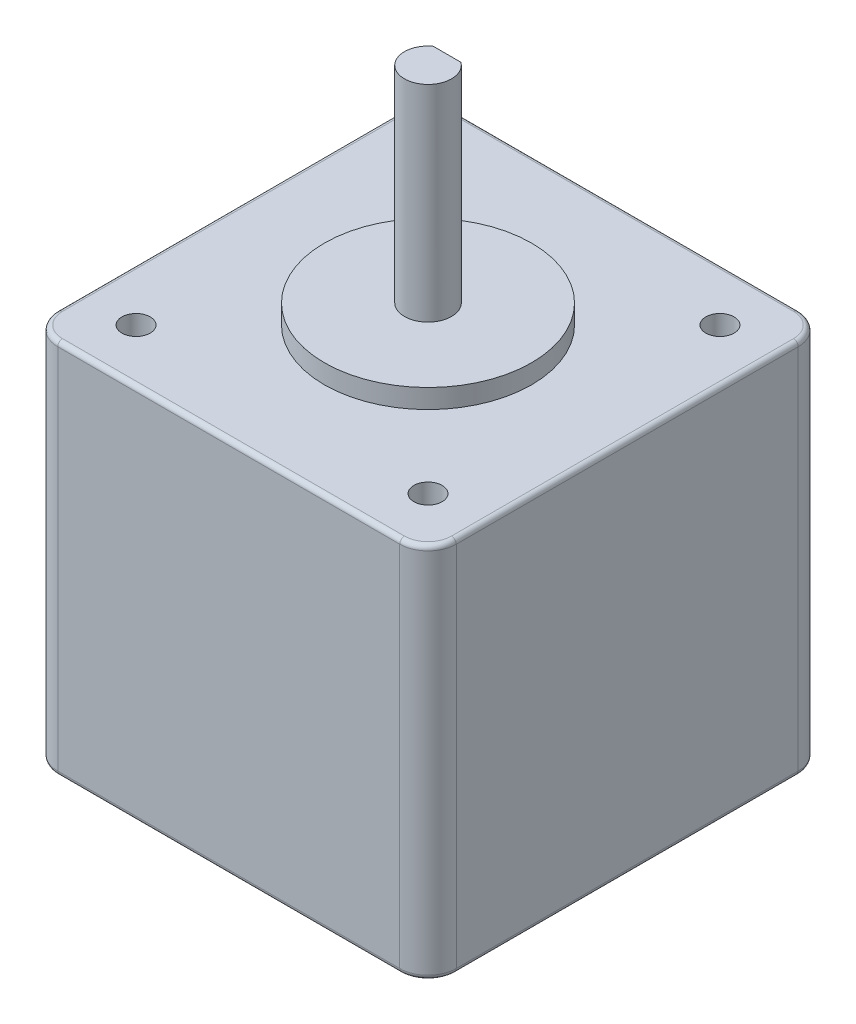
ISO-10303-21;
HEADER;
FILE_DESCRIPTION(('STEP AP214'),'2;1');
FILE_NAME('part.step','',(''),(''),'','','');
FILE_SCHEMA(('AUTOMOTIVE_DESIGN { 1 0 10303 214 1 1 1 1 }'));
ENDSEC;
DATA;
#1=APPLICATION_CONTEXT('core data for automotive mechanical design processes');
#2=APPLICATION_PROTOCOL_DEFINITION('international standard','automotive_design',2000,#1);
#3=PRODUCT_CONTEXT('',#1,'mechanical');
#4=PRODUCT('Part','Part','',(#3));
#5=PRODUCT_RELATED_PRODUCT_CATEGORY('part','',(#4));
#6=PRODUCT_DEFINITION_FORMATION('','',#4);
#7=PRODUCT_DEFINITION_CONTEXT('part definition',#1,'design');
#8=PRODUCT_DEFINITION('design','',#6,#7);
#9=PRODUCT_DEFINITION_SHAPE('','',#8);
#10=(LENGTH_UNIT() NAMED_UNIT(*) SI_UNIT(.MILLI.,.METRE.));
#11=(NAMED_UNIT(*) PLANE_ANGLE_UNIT() SI_UNIT($,.RADIAN.));
#12=(NAMED_UNIT(*) SI_UNIT($,.STERADIAN.) SOLID_ANGLE_UNIT());
#13=UNCERTAINTY_MEASURE_WITH_UNIT(LENGTH_MEASURE(1.E-05),#10,'distance_accuracy_value','');
#14=(GEOMETRIC_REPRESENTATION_CONTEXT(3) GLOBAL_UNCERTAINTY_ASSIGNED_CONTEXT((#13)) GLOBAL_UNIT_ASSIGNED_CONTEXT((#10,
#11,#12)) REPRESENTATION_CONTEXT('',''));
#15=CARTESIAN_POINT('',(0.,0.,0.));
#16=DIRECTION('',(0.,0.,1.));
#17=DIRECTION('',(1.,0.,0.));
#18=AXIS2_PLACEMENT_3D('',#15,#16,#17);
#19=CARTESIAN_POINT('',(0.,40.,0.));
#20=DIRECTION('',(0.,-1.,0.));
#21=DIRECTION('',(0.,0.,-1.));
#22=AXIS2_PLACEMENT_3D('',#19,#20,#21);
#23=PLANE('',#22);
#24=DIRECTION('',(0.,0.,1.));
#25=VECTOR('',#24,1.);
#26=CARTESIAN_POINT('',(0.5,40.,0.));
#27=LINE('',#26,#25);
#28=CARTESIAN_POINT('',(0.5,40.,-39.3));
#29=VERTEX_POINT('',#28);
#30=CARTESIAN_POINT('',(0.5,40.,-3.));
#31=VERTEX_POINT('',#30);
#32=EDGE_CURVE('E50',#29,#31,#27,.T.);
#33=ORIENTED_EDGE('',*,*,#32,.T.);
#34=CARTESIAN_POINT('',(3.,40.,-3.));
#35=DIRECTION('',(0.,-1.,0.));
#36=DIRECTION('',(0.,0.,-1.));
#37=AXIS2_PLACEMENT_3D('',#34,#35,#36);
#38=CIRCLE('',#37,2.5);
#39=CARTESIAN_POINT('',(3.,40.,-0.5));
#40=VERTEX_POINT('',#39);
#41=EDGE_CURVE('E300',#31,#40,#38,.F.);
#42=ORIENTED_EDGE('',*,*,#41,.T.);
#43=DIRECTION('',(1.,0.,0.));
#44=VECTOR('',#43,1.);
#45=CARTESIAN_POINT('',(0.,40.,-0.5));
#46=LINE('',#45,#44);
#47=CARTESIAN_POINT('',(39.3,40.,-0.5));
#48=VERTEX_POINT('',#47);
#49=EDGE_CURVE('E288',#40,#48,#46,.T.);
#50=ORIENTED_EDGE('',*,*,#49,.T.);
#51=CARTESIAN_POINT('',(39.3,40.,-3.));
#52=DIRECTION('',(0.,-1.,0.));
#53=DIRECTION('',(0.,0.,-1.));
#54=AXIS2_PLACEMENT_3D('',#51,#52,#53);
#55=CIRCLE('',#54,2.5);
#56=CARTESIAN_POINT('',(41.8,40.,-3.));
#57=VERTEX_POINT('',#56);
#58=EDGE_CURVE('E290',#48,#57,#55,.F.);
#59=ORIENTED_EDGE('',*,*,#58,.T.);
#60=DIRECTION('',(0.,0.,-1.));
#61=VECTOR('',#60,1.);
#62=CARTESIAN_POINT('',(41.8,40.,0.));
#63=LINE('',#62,#61);
#64=CARTESIAN_POINT('',(41.8,40.,-39.3));
#65=VERTEX_POINT('',#64);
#66=EDGE_CURVE('E292',#57,#65,#63,.T.);
#67=ORIENTED_EDGE('',*,*,#66,.T.);
#68=CARTESIAN_POINT('',(39.3,40.,-39.3));
#69=DIRECTION('',(0.,-1.,0.));
#70=DIRECTION('',(0.,0.,-1.));
#71=AXIS2_PLACEMENT_3D('',#68,#69,#70);
#72=CIRCLE('',#71,2.5);
#73=CARTESIAN_POINT('',(39.3,40.,-41.8));
#74=VERTEX_POINT('',#73);
#75=EDGE_CURVE('E294',#65,#74,#72,.F.);
#76=ORIENTED_EDGE('',*,*,#75,.T.);
#77=DIRECTION('',(-1.,0.,0.));
#78=VECTOR('',#77,1.);
#79=CARTESIAN_POINT('',(0.,40.,-41.8));
#80=LINE('',#79,#78);
#81=CARTESIAN_POINT('',(3.,40.,-41.8));
#82=VERTEX_POINT('',#81);
#83=EDGE_CURVE('E296',#74,#82,#80,.T.);
#84=ORIENTED_EDGE('',*,*,#83,.T.);
#85=CARTESIAN_POINT('',(3.,40.,-39.3));
#86=DIRECTION('',(0.,-1.,0.));
#87=DIRECTION('',(0.,0.,-1.));
#88=AXIS2_PLACEMENT_3D('',#85,#86,#87);
#89=CIRCLE('',#88,2.5);
#90=EDGE_CURVE('E55',#82,#29,#89,.F.);
#91=ORIENTED_EDGE('',*,*,#90,.T.);
#92=EDGE_LOOP('',(#33,#42,#50,#59,#67,#76,#84,#91));
#93=FACE_BOUND('',#92,.T.);
#94=CARTESIAN_POINT('',(21.15,40.,-21.15));
#95=DIRECTION('',(0.,1.,0.));
#96=DIRECTION('',(0.,0.,1.));
#97=AXIS2_PLACEMENT_3D('',#94,#95,#96);
#98=CIRCLE('',#97,11.);
#99=CARTESIAN_POINT('',(21.15,40.,-10.15));
#100=VERTEX_POINT('',#99);
#101=EDGE_CURVE('E189',#100,#100,#98,.T.);
#102=ORIENTED_EDGE('',*,*,#101,.F.);
#103=EDGE_LOOP('',(#102));
#104=FACE_BOUND('',#103,.T.);
#105=CARTESIAN_POINT('',(5.655,40.,-36.645));
#106=DIRECTION('',(0.,1.,0.));
#107=DIRECTION('',(0.,0.,1.));
#108=AXIS2_PLACEMENT_3D('',#105,#106,#107);
#109=CIRCLE('',#108,1.5);
#110=CARTESIAN_POINT('',(5.655,40.,-35.145));
#111=VERTEX_POINT('',#110);
#112=EDGE_CURVE('E195',#111,#111,#109,.T.);
#113=ORIENTED_EDGE('',*,*,#112,.F.);
#114=EDGE_LOOP('',(#113));
#115=FACE_BOUND('',#114,.T.);
#116=CARTESIAN_POINT('',(36.645,40.,-36.645));
#117=DIRECTION('',(0.,1.,0.));
#118=DIRECTION('',(0.,0.,1.));
#119=AXIS2_PLACEMENT_3D('',#116,#117,#118);
#120=CIRCLE('',#119,1.5);
#121=CARTESIAN_POINT('',(36.645,40.,-35.145));
#122=VERTEX_POINT('',#121);
#123=EDGE_CURVE('E208',#122,#122,#120,.T.);
#124=ORIENTED_EDGE('',*,*,#123,.F.);
#125=EDGE_LOOP('',(#124));
#126=FACE_BOUND('',#125,.T.);
#127=CARTESIAN_POINT('',(36.645,40.,-5.655));
#128=DIRECTION('',(0.,1.,0.));
#129=DIRECTION('',(0.,0.,1.));
#130=AXIS2_PLACEMENT_3D('',#127,#128,#129);
#131=CIRCLE('',#130,1.5);
#132=CARTESIAN_POINT('',(36.645,40.,-4.155));
#133=VERTEX_POINT('',#132);
#134=EDGE_CURVE('E202',#133,#133,#131,.T.);
#135=ORIENTED_EDGE('',*,*,#134,.F.);
#136=EDGE_LOOP('',(#135));
#137=FACE_BOUND('',#136,.T.);
#138=CARTESIAN_POINT('',(5.655,40.,-5.655));
#139=DIRECTION('',(0.,1.,0.));
#140=DIRECTION('',(0.,0.,1.));
#141=AXIS2_PLACEMENT_3D('',#138,#139,#140);
#142=CIRCLE('',#141,1.5);
#143=CARTESIAN_POINT('',(5.655,40.,-4.155));
#144=VERTEX_POINT('',#143);
#145=EDGE_CURVE('E196',#144,#144,#142,.T.);
#146=ORIENTED_EDGE('',*,*,#145,.F.);
#147=EDGE_LOOP('',(#146));
#148=FACE_BOUND('',#147,.T.);
#149=ADVANCED_FACE('F33',(#93,#104,#115,#126,#137,#148),#23,.F.);
#150=CARTESIAN_POINT('',(0.,0.,0.));
#151=DIRECTION('',(0.,-1.,0.));
#152=DIRECTION('',(0.,0.,-1.));
#153=AXIS2_PLACEMENT_3D('',#150,#151,#152);
#154=PLANE('',#153);
#155=DIRECTION('',(1.,0.,0.));
#156=VECTOR('',#155,1.);
#157=CARTESIAN_POINT('',(3.,0.,-0.5));
#158=LINE('',#157,#156);
#159=CARTESIAN_POINT('',(39.3,0.,-0.5));
#160=VERTEX_POINT('',#159);
#161=CARTESIAN_POINT('',(3.,0.,-0.5));
#162=VERTEX_POINT('',#161);
#163=EDGE_CURVE('E241',#160,#162,#158,.F.);
#164=ORIENTED_EDGE('',*,*,#163,.T.);
#165=CARTESIAN_POINT('',(3.,0.,-3.));
#166=DIRECTION('',(0.,-1.,0.));
#167=DIRECTION('',(0.,0.,-1.));
#168=AXIS2_PLACEMENT_3D('',#165,#166,#167);
#169=CIRCLE('',#168,2.5);
#170=CARTESIAN_POINT('',(0.5,0.,-3.));
#171=VERTEX_POINT('',#170);
#172=EDGE_CURVE('E255',#162,#171,#169,.T.);
#173=ORIENTED_EDGE('',*,*,#172,.T.);
#174=DIRECTION('',(0.,0.,1.));
#175=VECTOR('',#174,1.);
#176=CARTESIAN_POINT('',(0.5,0.,-39.3));
#177=LINE('',#176,#175);
#178=CARTESIAN_POINT('',(0.5,0.,-39.3));
#179=VERTEX_POINT('',#178);
#180=EDGE_CURVE('E253',#171,#179,#177,.F.);
#181=ORIENTED_EDGE('',*,*,#180,.T.);
#182=CARTESIAN_POINT('',(3.,0.,-39.3));
#183=DIRECTION('',(0.,-1.,0.));
#184=DIRECTION('',(0.,0.,-1.));
#185=AXIS2_PLACEMENT_3D('',#182,#183,#184);
#186=CIRCLE('',#185,2.5);
#187=CARTESIAN_POINT('',(3.,0.,-41.8));
#188=VERTEX_POINT('',#187);
#189=EDGE_CURVE('E251',#179,#188,#186,.T.);
#190=ORIENTED_EDGE('',*,*,#189,.T.);
#191=DIRECTION('',(-1.,0.,0.));
#192=VECTOR('',#191,1.);
#193=CARTESIAN_POINT('',(39.3,0.,-41.8));
#194=LINE('',#193,#192);
#195=CARTESIAN_POINT('',(39.3,0.,-41.8));
#196=VERTEX_POINT('',#195);
#197=EDGE_CURVE('E249',#188,#196,#194,.F.);
#198=ORIENTED_EDGE('',*,*,#197,.T.);
#199=CARTESIAN_POINT('',(39.3,0.,-39.3));
#200=DIRECTION('',(0.,-1.,0.));
#201=DIRECTION('',(0.,0.,-1.));
#202=AXIS2_PLACEMENT_3D('',#199,#200,#201);
#203=CIRCLE('',#202,2.5);
#204=CARTESIAN_POINT('',(41.8,0.,-39.3));
#205=VERTEX_POINT('',#204);
#206=EDGE_CURVE('E247',#196,#205,#203,.T.);
#207=ORIENTED_EDGE('',*,*,#206,.T.);
#208=DIRECTION('',(0.,0.,-1.));
#209=VECTOR('',#208,1.);
#210=CARTESIAN_POINT('',(41.8,0.,-3.));
#211=LINE('',#210,#209);
#212=CARTESIAN_POINT('',(41.8,0.,-3.));
#213=VERTEX_POINT('',#212);
#214=EDGE_CURVE('E245',#205,#213,#211,.F.);
#215=ORIENTED_EDGE('',*,*,#214,.T.);
#216=CARTESIAN_POINT('',(39.3,0.,-3.));
#217=DIRECTION('',(0.,-1.,0.));
#218=DIRECTION('',(0.,0.,-1.));
#219=AXIS2_PLACEMENT_3D('',#216,#217,#218);
#220=CIRCLE('',#219,2.5);
#221=EDGE_CURVE('E243',#213,#160,#220,.T.);
#222=ORIENTED_EDGE('',*,*,#221,.T.);
#223=EDGE_LOOP('',(#164,#173,#181,#190,#198,#207,#215,#222));
#224=FACE_BOUND('',#223,.T.);
#225=CARTESIAN_POINT('',(36.645,0.,-5.655));
#226=DIRECTION('',(0.,1.,0.));
#227=DIRECTION('',(0.,0.,1.));
#228=AXIS2_PLACEMENT_3D('',#225,#226,#227);
#229=CIRCLE('',#228,1.5);
#230=CARTESIAN_POINT('',(36.645,0.,-4.155));
#231=VERTEX_POINT('',#230);
#232=EDGE_CURVE('E199',#231,#231,#229,.T.);
#233=ORIENTED_EDGE('',*,*,#232,.T.);
#234=EDGE_LOOP('',(#233));
#235=FACE_BOUND('',#234,.T.);
#236=CARTESIAN_POINT('',(5.655,0.,-36.645));
#237=DIRECTION('',(0.,1.,0.));
#238=DIRECTION('',(0.,0.,1.));
#239=AXIS2_PLACEMENT_3D('',#236,#237,#238);
#240=CIRCLE('',#239,1.5);
#241=CARTESIAN_POINT('',(5.655,0.,-35.145));
#242=VERTEX_POINT('',#241);
#243=EDGE_CURVE('E211',#242,#242,#240,.T.);
#244=ORIENTED_EDGE('',*,*,#243,.T.);
#245=EDGE_LOOP('',(#244));
#246=FACE_BOUND('',#245,.T.);
#247=CARTESIAN_POINT('',(36.645,0.,-36.645));
#248=DIRECTION('',(0.,1.,0.));
#249=DIRECTION('',(0.,0.,1.));
#250=AXIS2_PLACEMENT_3D('',#247,#248,#249);
#251=CIRCLE('',#250,1.5);
#252=CARTESIAN_POINT('',(36.645,0.,-35.145));
#253=VERTEX_POINT('',#252);
#254=EDGE_CURVE('E205',#253,#253,#251,.T.);
#255=ORIENTED_EDGE('',*,*,#254,.T.);
#256=EDGE_LOOP('',(#255));
#257=FACE_BOUND('',#256,.T.);
#258=CARTESIAN_POINT('',(5.655,0.,-5.655));
#259=DIRECTION('',(0.,1.,0.));
#260=DIRECTION('',(0.,0.,1.));
#261=AXIS2_PLACEMENT_3D('',#258,#259,#260);
#262=CIRCLE('',#261,1.5);
#263=CARTESIAN_POINT('',(5.655,0.,-4.155));
#264=VERTEX_POINT('',#263);
#265=EDGE_CURVE('E192',#264,#264,#262,.T.);
#266=ORIENTED_EDGE('',*,*,#265,.T.);
#267=EDGE_LOOP('',(#266));
#268=FACE_BOUND('',#267,.T.);
#269=ADVANCED_FACE('F377',(#224,#235,#246,#257,#268),#154,.T.);
#270=CARTESIAN_POINT('',(0.,40.,0.));
#271=DIRECTION('',(1.,0.,0.));
#272=DIRECTION('',(0.,0.,-1.));
#273=AXIS2_PLACEMENT_3D('',#270,#271,#272);
#274=PLANE('',#273);
#275=DIRECTION('',(0.,-1.,0.));
#276=VECTOR('',#275,1.);
#277=CARTESIAN_POINT('',(0.,40.,-39.3));
#278=LINE('',#277,#276);
#279=CARTESIAN_POINT('',(0.,39.5,-39.3));
#280=VERTEX_POINT('',#279);
#281=CARTESIAN_POINT('',(0.,0.5,-39.3));
#282=VERTEX_POINT('',#281);
#283=EDGE_CURVE('E220',#280,#282,#278,.T.);
#284=ORIENTED_EDGE('',*,*,#283,.T.);
#285=DIRECTION('',(0.,0.,1.));
#286=VECTOR('',#285,1.);
#287=CARTESIAN_POINT('',(0.,0.5,-3.));
#288=LINE('',#287,#286);
#289=CARTESIAN_POINT('',(0.,0.5,-3.));
#290=VERTEX_POINT('',#289);
#291=EDGE_CURVE('E266',#282,#290,#288,.T.);
#292=ORIENTED_EDGE('',*,*,#291,.T.);
#293=DIRECTION('',(0.,-1.,0.));
#294=VECTOR('',#293,1.);
#295=CARTESIAN_POINT('',(0.,40.,-3.));
#296=LINE('',#295,#294);
#297=CARTESIAN_POINT('',(0.,39.5,-3.));
#298=VERTEX_POINT('',#297);
#299=EDGE_CURVE('E188',#290,#298,#296,.F.);
#300=ORIENTED_EDGE('',*,*,#299,.T.);
#301=DIRECTION('',(0.,0.,1.));
#302=VECTOR('',#301,1.);
#303=CARTESIAN_POINT('',(0.,39.5,0.));
#304=LINE('',#303,#302);
#305=EDGE_CURVE('E264',#298,#280,#304,.F.);
#306=ORIENTED_EDGE('',*,*,#305,.T.);
#307=EDGE_LOOP('',(#284,#292,#300,#306));
#308=FACE_BOUND('',#307,.T.);
#309=ADVANCED_FACE('F408',(#308),#274,.F.);
#310=CARTESIAN_POINT('',(0.,40.,0.));
#311=DIRECTION('',(0.,0.,-1.));
#312=DIRECTION('',(-1.,0.,0.));
#313=AXIS2_PLACEMENT_3D('',#310,#311,#312);
#314=PLANE('',#313);
#315=DIRECTION('',(0.,-1.,0.));
#316=VECTOR('',#315,1.);
#317=CARTESIAN_POINT('',(3.,40.,0.));
#318=LINE('',#317,#316);
#319=CARTESIAN_POINT('',(3.,39.5,0.));
#320=VERTEX_POINT('',#319);
#321=CARTESIAN_POINT('',(3.,0.5,0.));
#322=VERTEX_POINT('',#321);
#323=EDGE_CURVE('E235',#320,#322,#318,.T.);
#324=ORIENTED_EDGE('',*,*,#323,.T.);
#325=DIRECTION('',(1.,0.,0.));
#326=VECTOR('',#325,1.);
#327=CARTESIAN_POINT('',(39.3,0.5,0.));
#328=LINE('',#327,#326);
#329=CARTESIAN_POINT('',(39.3,0.5,0.));
#330=VERTEX_POINT('',#329);
#331=EDGE_CURVE('E11',#322,#330,#328,.T.);
#332=ORIENTED_EDGE('',*,*,#331,.T.);
#333=DIRECTION('',(0.,-1.,0.));
#334=VECTOR('',#333,1.);
#335=CARTESIAN_POINT('',(39.3,40.,0.));
#336=LINE('',#335,#334);
#337=CARTESIAN_POINT('',(39.3,39.5,0.));
#338=VERTEX_POINT('',#337);
#339=EDGE_CURVE('E238',#330,#338,#336,.F.);
#340=ORIENTED_EDGE('',*,*,#339,.T.);
#341=DIRECTION('',(1.,0.,0.));
#342=VECTOR('',#341,1.);
#343=CARTESIAN_POINT('',(0.,39.5,0.));
#344=LINE('',#343,#342);
#345=EDGE_CURVE('E42',#338,#320,#344,.F.);
#346=ORIENTED_EDGE('',*,*,#345,.T.);
#347=EDGE_LOOP('',(#324,#332,#340,#346));
#348=FACE_BOUND('',#347,.T.);
#349=ADVANCED_FACE('F422',(#348),#314,.F.);
#350=CARTESIAN_POINT('',(42.3,40.,0.));
#351=DIRECTION('',(-1.,0.,0.));
#352=DIRECTION('',(0.,0.,1.));
#353=AXIS2_PLACEMENT_3D('',#350,#351,#352);
#354=PLANE('',#353);
#355=DIRECTION('',(0.,-1.,0.));
#356=VECTOR('',#355,1.);
#357=CARTESIAN_POINT('',(42.3,40.,-3.));
#358=LINE('',#357,#356);
#359=CARTESIAN_POINT('',(42.3,39.5,-3.));
#360=VERTEX_POINT('',#359);
#361=CARTESIAN_POINT('',(42.3,0.5,-3.));
#362=VERTEX_POINT('',#361);
#363=EDGE_CURVE('E229',#360,#362,#358,.T.);
#364=ORIENTED_EDGE('',*,*,#363,.T.);
#365=DIRECTION('',(0.,0.,-1.));
#366=VECTOR('',#365,1.);
#367=CARTESIAN_POINT('',(42.3,0.5,-39.3));
#368=LINE('',#367,#366);
#369=CARTESIAN_POINT('',(42.3,0.5,-39.3));
#370=VERTEX_POINT('',#369);
#371=EDGE_CURVE('E282',#362,#370,#368,.T.);
#372=ORIENTED_EDGE('',*,*,#371,.T.);
#373=DIRECTION('',(0.,-1.,0.));
#374=VECTOR('',#373,1.);
#375=CARTESIAN_POINT('',(42.3,40.,-39.3));
#376=LINE('',#375,#374);
#377=CARTESIAN_POINT('',(42.3,39.5,-39.3));
#378=VERTEX_POINT('',#377);
#379=EDGE_CURVE('E232',#370,#378,#376,.F.);
#380=ORIENTED_EDGE('',*,*,#379,.T.);
#381=DIRECTION('',(0.,0.,-1.));
#382=VECTOR('',#381,1.);
#383=CARTESIAN_POINT('',(42.3,39.5,0.));
#384=LINE('',#383,#382);
#385=EDGE_CURVE('E280',#378,#360,#384,.F.);
#386=ORIENTED_EDGE('',*,*,#385,.T.);
#387=EDGE_LOOP('',(#364,#372,#380,#386));
#388=FACE_BOUND('',#387,.T.);
#389=ADVANCED_FACE('F362',(#388),#354,.F.);
#390=CARTESIAN_POINT('',(0.,40.,-42.3));
#391=DIRECTION('',(0.,0.,1.));
#392=DIRECTION('',(1.,0.,0.));
#393=AXIS2_PLACEMENT_3D('',#390,#391,#392);
#394=PLANE('',#393);
#395=DIRECTION('',(0.,-1.,0.));
#396=VECTOR('',#395,1.);
#397=CARTESIAN_POINT('',(39.3,40.,-42.3));
#398=LINE('',#397,#396);
#399=CARTESIAN_POINT('',(39.3,39.5,-42.3));
#400=VERTEX_POINT('',#399);
#401=CARTESIAN_POINT('',(39.3,0.5,-42.3));
#402=VERTEX_POINT('',#401);
#403=EDGE_CURVE('E223',#400,#402,#398,.T.);
#404=ORIENTED_EDGE('',*,*,#403,.T.);
#405=DIRECTION('',(-1.,0.,0.));
#406=VECTOR('',#405,1.);
#407=CARTESIAN_POINT('',(3.,0.5,-42.3));
#408=LINE('',#407,#406);
#409=CARTESIAN_POINT('',(3.,0.5,-42.3));
#410=VERTEX_POINT('',#409);
#411=EDGE_CURVE('E274',#402,#410,#408,.T.);
#412=ORIENTED_EDGE('',*,*,#411,.T.);
#413=DIRECTION('',(0.,-1.,0.));
#414=VECTOR('',#413,1.);
#415=CARTESIAN_POINT('',(3.,40.,-42.3));
#416=LINE('',#415,#414);
#417=CARTESIAN_POINT('',(3.,39.5,-42.3));
#418=VERTEX_POINT('',#417);
#419=EDGE_CURVE('E226',#410,#418,#416,.F.);
#420=ORIENTED_EDGE('',*,*,#419,.T.);
#421=DIRECTION('',(-1.,0.,0.));
#422=VECTOR('',#421,1.);
#423=CARTESIAN_POINT('',(0.,39.5,-42.3));
#424=LINE('',#423,#422);
#425=EDGE_CURVE('E272',#418,#400,#424,.F.);
#426=ORIENTED_EDGE('',*,*,#425,.T.);
#427=EDGE_LOOP('',(#404,#412,#420,#426));
#428=FACE_BOUND('',#427,.T.);
#429=ADVANCED_FACE('F387',(#428),#394,.F.);
#430=CARTESIAN_POINT('',(5.655,40.,-36.645));
#431=DIRECTION('',(0.,-1.,0.));
#432=DIRECTION('',(0.,0.,-1.));
#433=AXIS2_PLACEMENT_3D('',#430,#431,#432);
#434=CYLINDRICAL_SURFACE('',#433,1.5);
#435=ORIENTED_EDGE('',*,*,#112,.T.);
#436=EDGE_LOOP('',(#435));
#437=FACE_BOUND('',#436,.T.);
#438=ORIENTED_EDGE('',*,*,#243,.F.);
#439=EDGE_LOOP('',(#438));
#440=FACE_BOUND('',#439,.T.);
#441=ADVANCED_FACE('F461',(#437,#440),#434,.F.);
#442=CARTESIAN_POINT('',(36.645,40.,-36.645));
#443=DIRECTION('',(0.,-1.,0.));
#444=DIRECTION('',(0.,0.,-1.));
#445=AXIS2_PLACEMENT_3D('',#442,#443,#444);
#446=CYLINDRICAL_SURFACE('',#445,1.5);
#447=ORIENTED_EDGE('',*,*,#123,.T.);
#448=EDGE_LOOP('',(#447));
#449=FACE_BOUND('',#448,.T.);
#450=ORIENTED_EDGE('',*,*,#254,.F.);
#451=EDGE_LOOP('',(#450));
#452=FACE_BOUND('',#451,.T.);
#453=ADVANCED_FACE('F671',(#449,#452),#446,.F.);
#454=CARTESIAN_POINT('',(36.645,40.,-5.655));
#455=DIRECTION('',(0.,-1.,0.));
#456=DIRECTION('',(0.,0.,-1.));
#457=AXIS2_PLACEMENT_3D('',#454,#455,#456);
#458=CYLINDRICAL_SURFACE('',#457,1.5);
#459=ORIENTED_EDGE('',*,*,#134,.T.);
#460=EDGE_LOOP('',(#459));
#461=FACE_BOUND('',#460,.T.);
#462=ORIENTED_EDGE('',*,*,#232,.F.);
#463=EDGE_LOOP('',(#462));
#464=FACE_BOUND('',#463,.T.);
#465=ADVANCED_FACE('F662',(#461,#464),#458,.F.);
#466=CARTESIAN_POINT('',(5.655,40.,-5.655));
#467=DIRECTION('',(0.,-1.,0.));
#468=DIRECTION('',(0.,0.,-1.));
#469=AXIS2_PLACEMENT_3D('',#466,#467,#468);
#470=CYLINDRICAL_SURFACE('',#469,1.5);
#471=ORIENTED_EDGE('',*,*,#145,.T.);
#472=EDGE_LOOP('',(#471));
#473=FACE_BOUND('',#472,.T.);
#474=ORIENTED_EDGE('',*,*,#265,.F.);
#475=EDGE_LOOP('',(#474));
#476=FACE_BOUND('',#475,.T.);
#477=ADVANCED_FACE('F653',(#473,#476),#470,.F.);
#478=CARTESIAN_POINT('',(21.15,42.03,-21.15));
#479=DIRECTION('',(0.,-1.,0.));
#480=DIRECTION('',(0.,0.,-1.));
#481=AXIS2_PLACEMENT_3D('',#478,#479,#480);
#482=CYLINDRICAL_SURFACE('',#481,11.);
#483=CARTESIAN_POINT('',(21.15,42.03,-21.15));
#484=DIRECTION('',(0.,1.,0.));
#485=DIRECTION('',(0.,0.,1.));
#486=AXIS2_PLACEMENT_3D('',#483,#484,#485);
#487=CIRCLE('',#486,11.);
#488=CARTESIAN_POINT('',(21.15,42.03,-10.15));
#489=VERTEX_POINT('',#488);
#490=EDGE_CURVE('E184',#489,#489,#487,.T.);
#491=ORIENTED_EDGE('',*,*,#490,.F.);
#492=EDGE_LOOP('',(#491));
#493=FACE_BOUND('',#492,.T.);
#494=ORIENTED_EDGE('',*,*,#101,.T.);
#495=EDGE_LOOP('',(#494));
#496=FACE_BOUND('',#495,.T.);
#497=ADVANCED_FACE('F644',(#493,#496),#482,.T.);
#498=CARTESIAN_POINT('',(21.15,42.03,-21.15));
#499=DIRECTION('',(0.,1.,0.));
#500=DIRECTION('',(0.,0.,1.));
#501=AXIS2_PLACEMENT_3D('',#498,#499,#500);
#502=PLANE('',#501);
#503=CARTESIAN_POINT('',(21.15,42.03,-21.15));
#504=DIRECTION('',(0.,1.,0.));
#505=DIRECTION('',(0.,0.,1.));
#506=AXIS2_PLACEMENT_3D('',#503,#504,#505);
#507=CIRCLE('',#506,2.5);
#508=CARTESIAN_POINT('',(21.15,42.03,-18.65));
#509=VERTEX_POINT('',#508);
#510=EDGE_CURVE('E185',#509,#509,#507,.T.);
#511=ORIENTED_EDGE('',*,*,#510,.F.);
#512=EDGE_LOOP('',(#511));
#513=FACE_BOUND('',#512,.T.);
#514=ORIENTED_EDGE('',*,*,#490,.T.);
#515=EDGE_LOOP('',(#514));
#516=FACE_BOUND('',#515,.T.);
#517=ADVANCED_FACE('F636',(#513,#516),#502,.T.);
#518=CARTESIAN_POINT('',(21.15,63.88,-21.15));
#519=DIRECTION('',(0.,-1.,0.));
#520=DIRECTION('',(0.,0.,-1.));
#521=AXIS2_PLACEMENT_3D('',#518,#519,#520);
#522=CYLINDRICAL_SURFACE('',#521,2.5);
#523=CARTESIAN_POINT('',(21.15,63.88,-21.15));
#524=DIRECTION('',(0.,1.,0.));
#525=DIRECTION('',(0.,0.,1.));
#526=AXIS2_PLACEMENT_3D('',#523,#524,#525);
#527=CIRCLE('',#526,2.5);
#528=CARTESIAN_POINT('',(19.6770437888383,63.88,-23.17));
#529=VERTEX_POINT('',#528);
#530=CARTESIAN_POINT('',(22.6229562111618,63.88,-23.17));
#531=VERTEX_POINT('',#530);
#532=EDGE_CURVE('E178',#529,#531,#527,.T.);
#533=ORIENTED_EDGE('',*,*,#532,.F.);
#534=DIRECTION('',(0.,1.,0.));
#535=VECTOR('',#534,1.);
#536=CARTESIAN_POINT('',(19.6770437888383,49.02,-23.17));
#537=LINE('',#536,#535);
#538=CARTESIAN_POINT('',(19.6770437888383,49.02,-23.17));
#539=VERTEX_POINT('',#538);
#540=EDGE_CURVE('E170',#539,#529,#537,.T.);
#541=ORIENTED_EDGE('',*,*,#540,.F.);
#542=CARTESIAN_POINT('',(21.15,49.02,-21.15));
#543=DIRECTION('',(0.,1.,0.));
#544=DIRECTION('',(0.,0.,-1.));
#545=AXIS2_PLACEMENT_3D('',#542,#543,#544);
#546=CIRCLE('',#545,2.5);
#547=CARTESIAN_POINT('',(22.6229562111618,49.02,-23.17));
#548=VERTEX_POINT('',#547);
#549=EDGE_CURVE('E159',#548,#539,#546,.T.);
#550=ORIENTED_EDGE('',*,*,#549,.F.);
#551=DIRECTION('',(0.,1.,0.));
#552=VECTOR('',#551,1.);
#553=CARTESIAN_POINT('',(22.6229562111618,49.02,-23.17));
#554=LINE('',#553,#552);
#555=EDGE_CURVE('E172',#548,#531,#554,.T.);
#556=ORIENTED_EDGE('',*,*,#555,.T.);
#557=EDGE_LOOP('',(#533,#541,#550,#556));
#558=FACE_BOUND('',#557,.T.);
#559=ORIENTED_EDGE('',*,*,#510,.T.);
#560=EDGE_LOOP('',(#559));
#561=FACE_BOUND('',#560,.T.);
#562=ADVANCED_FACE('F175',(#558,#561),#522,.T.);
#563=CARTESIAN_POINT('',(21.15,63.88,-21.15));
#564=DIRECTION('',(0.,1.,0.));
#565=DIRECTION('',(0.,0.,1.));
#566=AXIS2_PLACEMENT_3D('',#563,#564,#565);
#567=PLANE('',#566);
#568=DIRECTION('',(1.,0.,0.));
#569=VECTOR('',#568,1.);
#570=CARTESIAN_POINT('',(19.6770437888383,63.88,-23.17));
#571=LINE('',#570,#569);
#572=EDGE_CURVE('E166',#529,#531,#571,.T.);
#573=ORIENTED_EDGE('',*,*,#572,.F.);
#574=ORIENTED_EDGE('',*,*,#532,.T.);
#575=EDGE_LOOP('',(#573,#574));
#576=FACE_BOUND('',#575,.T.);
#577=ADVANCED_FACE('F620',(#576),#567,.T.);
#578=CARTESIAN_POINT('',(19.6770437888383,49.02,-23.17));
#579=DIRECTION('',(0.,0.,1.));
#580=DIRECTION('',(1.,0.,0.));
#581=AXIS2_PLACEMENT_3D('',#578,#579,#580);
#582=PLANE('',#581);
#583=ORIENTED_EDGE('',*,*,#572,.T.);
#584=ORIENTED_EDGE('',*,*,#555,.F.);
#585=DIRECTION('',(1.,0.,0.));
#586=VECTOR('',#585,1.);
#587=CARTESIAN_POINT('',(19.6770437888383,49.02,-23.17));
#588=LINE('',#587,#586);
#589=EDGE_CURVE('E162',#539,#548,#588,.T.);
#590=ORIENTED_EDGE('',*,*,#589,.F.);
#591=ORIENTED_EDGE('',*,*,#540,.T.);
#592=EDGE_LOOP('',(#583,#584,#590,#591));
#593=FACE_BOUND('',#592,.T.);
#594=ADVANCED_FACE('F169',(#593),#582,.F.);
#595=CARTESIAN_POINT('',(21.15,49.02,-21.15));
#596=DIRECTION('',(0.,-1.,0.));
#597=DIRECTION('',(0.,0.,-1.));
#598=AXIS2_PLACEMENT_3D('',#595,#596,#597);
#599=PLANE('',#598);
#600=ORIENTED_EDGE('',*,*,#549,.T.);
#601=ORIENTED_EDGE('',*,*,#589,.T.);
#602=EDGE_LOOP('',(#600,#601));
#603=FACE_BOUND('',#602,.T.);
#604=ADVANCED_FACE('F161',(#603),#599,.F.);
#605=CARTESIAN_POINT('',(3.,40.,-39.3));
#606=DIRECTION('',(0.,-1.,0.));
#607=DIRECTION('',(0.,0.,-1.));
#608=AXIS2_PLACEMENT_3D('',#605,#606,#607);
#609=CYLINDRICAL_SURFACE('',#608,3.);
#610=ORIENTED_EDGE('',*,*,#419,.F.);
#611=CARTESIAN_POINT('',(3.,0.5,-39.3));
#612=DIRECTION('',(0.,-1.,0.));
#613=DIRECTION('',(0.,0.,-1.));
#614=AXIS2_PLACEMENT_3D('',#611,#612,#613);
#615=CIRCLE('',#614,3.);
#616=EDGE_CURVE('E270',#410,#282,#615,.F.);
#617=ORIENTED_EDGE('',*,*,#616,.T.);
#618=ORIENTED_EDGE('',*,*,#283,.F.);
#619=CARTESIAN_POINT('',(3.,39.5,-39.3));
#620=DIRECTION('',(0.,-1.,0.));
#621=DIRECTION('',(0.,0.,-1.));
#622=AXIS2_PLACEMENT_3D('',#619,#620,#621);
#623=CIRCLE('',#622,3.);
#624=EDGE_CURVE('E268',#280,#418,#623,.T.);
#625=ORIENTED_EDGE('',*,*,#624,.T.);
#626=EDGE_LOOP('',(#610,#617,#618,#625));
#627=FACE_BOUND('',#626,.T.);
#628=ADVANCED_FACE('F391',(#627),#609,.T.);
#629=CARTESIAN_POINT('',(39.3,40.,-39.3));
#630=DIRECTION('',(0.,-1.,0.));
#631=DIRECTION('',(0.,0.,-1.));
#632=AXIS2_PLACEMENT_3D('',#629,#630,#631);
#633=CYLINDRICAL_SURFACE('',#632,3.);
#634=ORIENTED_EDGE('',*,*,#379,.F.);
#635=CARTESIAN_POINT('',(39.3,0.5,-39.3));
#636=DIRECTION('',(0.,-1.,0.));
#637=DIRECTION('',(0.,0.,-1.));
#638=AXIS2_PLACEMENT_3D('',#635,#636,#637);
#639=CIRCLE('',#638,3.);
#640=EDGE_CURVE('E278',#370,#402,#639,.F.);
#641=ORIENTED_EDGE('',*,*,#640,.T.);
#642=ORIENTED_EDGE('',*,*,#403,.F.);
#643=CARTESIAN_POINT('',(39.3,39.5,-39.3));
#644=DIRECTION('',(0.,-1.,0.));
#645=DIRECTION('',(0.,0.,-1.));
#646=AXIS2_PLACEMENT_3D('',#643,#644,#645);
#647=CIRCLE('',#646,3.);
#648=EDGE_CURVE('E276',#400,#378,#647,.T.);
#649=ORIENTED_EDGE('',*,*,#648,.T.);
#650=EDGE_LOOP('',(#634,#641,#642,#649));
#651=FACE_BOUND('',#650,.T.);
#652=ADVANCED_FACE('F359',(#651),#633,.T.);
#653=CARTESIAN_POINT('',(39.3,40.,-3.));
#654=DIRECTION('',(0.,-1.,0.));
#655=DIRECTION('',(0.,0.,-1.));
#656=AXIS2_PLACEMENT_3D('',#653,#654,#655);
#657=CYLINDRICAL_SURFACE('',#656,3.);
#658=ORIENTED_EDGE('',*,*,#339,.F.);
#659=CARTESIAN_POINT('',(39.3,0.5,-3.));
#660=DIRECTION('',(0.,-1.,0.));
#661=DIRECTION('',(0.,0.,-1.));
#662=AXIS2_PLACEMENT_3D('',#659,#660,#661);
#663=CIRCLE('',#662,3.);
#664=EDGE_CURVE('E286',#330,#362,#663,.F.);
#665=ORIENTED_EDGE('',*,*,#664,.T.);
#666=ORIENTED_EDGE('',*,*,#363,.F.);
#667=CARTESIAN_POINT('',(39.3,39.5,-3.));
#668=DIRECTION('',(0.,-1.,0.));
#669=DIRECTION('',(0.,0.,-1.));
#670=AXIS2_PLACEMENT_3D('',#667,#668,#669);
#671=CIRCLE('',#670,3.);
#672=EDGE_CURVE('E284',#360,#338,#671,.T.);
#673=ORIENTED_EDGE('',*,*,#672,.T.);
#674=EDGE_LOOP('',(#658,#665,#666,#673));
#675=FACE_BOUND('',#674,.T.);
#676=ADVANCED_FACE('F425',(#675),#657,.T.);
#677=CARTESIAN_POINT('',(3.,40.,-3.));
#678=DIRECTION('',(0.,-1.,0.));
#679=DIRECTION('',(0.,0.,-1.));
#680=AXIS2_PLACEMENT_3D('',#677,#678,#679);
#681=CYLINDRICAL_SURFACE('',#680,3.);
#682=ORIENTED_EDGE('',*,*,#299,.F.);
#683=CARTESIAN_POINT('',(3.,0.5,-3.));
#684=DIRECTION('',(0.,-1.,0.));
#685=DIRECTION('',(0.,0.,-1.));
#686=AXIS2_PLACEMENT_3D('',#683,#684,#685);
#687=CIRCLE('',#686,3.);
#688=EDGE_CURVE('E261',#290,#322,#687,.F.);
#689=ORIENTED_EDGE('',*,*,#688,.T.);
#690=ORIENTED_EDGE('',*,*,#323,.F.);
#691=CARTESIAN_POINT('',(3.,39.5,-3.));
#692=DIRECTION('',(0.,-1.,0.));
#693=DIRECTION('',(0.,0.,-1.));
#694=AXIS2_PLACEMENT_3D('',#691,#692,#693);
#695=CIRCLE('',#694,3.);
#696=EDGE_CURVE('E258',#320,#298,#695,.T.);
#697=ORIENTED_EDGE('',*,*,#696,.T.);
#698=EDGE_LOOP('',(#682,#689,#690,#697));
#699=FACE_BOUND('',#698,.T.);
#700=ADVANCED_FACE('F411',(#699),#681,.T.);
#701=CARTESIAN_POINT('',(39.3,0.5,-39.3));
#702=DIRECTION('',(0.,-1.,0.));
#703=DIRECTION('',(0.,0.,-1.));
#704=AXIS2_PLACEMENT_3D('',#701,#702,#703);
#705=TOROIDAL_SURFACE('',#704,2.5,0.5);
#706=CARTESIAN_POINT('',(39.3,0.5,-41.8));
#707=DIRECTION('',(-1.,0.,0.));
#708=DIRECTION('',(0.,0.,1.));
#709=AXIS2_PLACEMENT_3D('',#706,#707,#708);
#710=CIRCLE('',#709,0.5);
#711=EDGE_CURVE('E319',#402,#196,#710,.T.);
#712=ORIENTED_EDGE('',*,*,#711,.F.);
#713=ORIENTED_EDGE('',*,*,#640,.F.);
#714=CARTESIAN_POINT('',(41.8,0.5,-39.3));
#715=DIRECTION('',(0.,0.,1.));
#716=DIRECTION('',(1.,0.,0.));
#717=AXIS2_PLACEMENT_3D('',#714,#715,#716);
#718=CIRCLE('',#717,0.5);
#719=EDGE_CURVE('E322',#205,#370,#718,.T.);
#720=ORIENTED_EDGE('',*,*,#719,.F.);
#721=ORIENTED_EDGE('',*,*,#206,.F.);
#722=EDGE_LOOP('',(#712,#713,#720,#721));
#723=FACE_BOUND('',#722,.T.);
#724=ADVANCED_FACE('F384',(#723),#705,.T.);
#725=CARTESIAN_POINT('',(41.8,0.5,0.));
#726=DIRECTION('',(0.,0.,1.));
#727=DIRECTION('',(1.,0.,0.));
#728=AXIS2_PLACEMENT_3D('',#725,#726,#727);
#729=CYLINDRICAL_SURFACE('',#728,0.5);
#730=ORIENTED_EDGE('',*,*,#719,.T.);
#731=ORIENTED_EDGE('',*,*,#371,.F.);
#732=CARTESIAN_POINT('',(41.8,0.5,-3.));
#733=DIRECTION('',(0.,0.,1.));
#734=DIRECTION('',(1.,0.,0.));
#735=AXIS2_PLACEMENT_3D('',#732,#733,#734);
#736=CIRCLE('',#735,0.5);
#737=EDGE_CURVE('E316',#213,#362,#736,.T.);
#738=ORIENTED_EDGE('',*,*,#737,.F.);
#739=ORIENTED_EDGE('',*,*,#214,.F.);
#740=EDGE_LOOP('',(#730,#731,#738,#739));
#741=FACE_BOUND('',#740,.T.);
#742=ADVANCED_FACE('F367',(#741),#729,.T.);
#743=CARTESIAN_POINT('',(0.,0.5,-41.8));
#744=DIRECTION('',(1.,0.,0.));
#745=DIRECTION('',(0.,0.,-1.));
#746=AXIS2_PLACEMENT_3D('',#743,#744,#745);
#747=CYLINDRICAL_SURFACE('',#746,0.5);
#748=ORIENTED_EDGE('',*,*,#711,.T.);
#749=ORIENTED_EDGE('',*,*,#197,.F.);
#750=CARTESIAN_POINT('',(3.,0.5,-41.8));
#751=DIRECTION('',(-1.,0.,0.));
#752=DIRECTION('',(0.,0.,1.));
#753=AXIS2_PLACEMENT_3D('',#750,#751,#752);
#754=CIRCLE('',#753,0.5);
#755=EDGE_CURVE('E313',#410,#188,#754,.T.);
#756=ORIENTED_EDGE('',*,*,#755,.F.);
#757=ORIENTED_EDGE('',*,*,#411,.F.);
#758=EDGE_LOOP('',(#748,#749,#756,#757));
#759=FACE_BOUND('',#758,.T.);
#760=ADVANCED_FACE('F396',(#759),#747,.T.);
#761=CARTESIAN_POINT('',(39.3,0.5,-3.));
#762=DIRECTION('',(0.,-1.,0.));
#763=DIRECTION('',(0.,0.,-1.));
#764=AXIS2_PLACEMENT_3D('',#761,#762,#763);
#765=TOROIDAL_SURFACE('',#764,2.5,0.5);
#766=ORIENTED_EDGE('',*,*,#737,.T.);
#767=ORIENTED_EDGE('',*,*,#664,.F.);
#768=CARTESIAN_POINT('',(39.3,0.5,-0.5));
#769=DIRECTION('',(-1.,0.,0.));
#770=DIRECTION('',(0.,0.,1.));
#771=AXIS2_PLACEMENT_3D('',#768,#769,#770);
#772=CIRCLE('',#771,0.5);
#773=EDGE_CURVE('E310',#160,#330,#772,.T.);
#774=ORIENTED_EDGE('',*,*,#773,.F.);
#775=ORIENTED_EDGE('',*,*,#221,.F.);
#776=EDGE_LOOP('',(#766,#767,#774,#775));
#777=FACE_BOUND('',#776,.T.);
#778=ADVANCED_FACE('F373',(#777),#765,.T.);
#779=CARTESIAN_POINT('',(3.,0.5,-39.3));
#780=DIRECTION('',(0.,-1.,0.));
#781=DIRECTION('',(0.,0.,-1.));
#782=AXIS2_PLACEMENT_3D('',#779,#780,#781);
#783=TOROIDAL_SURFACE('',#782,2.5,0.5);
#784=ORIENTED_EDGE('',*,*,#755,.T.);
#785=ORIENTED_EDGE('',*,*,#189,.F.);
#786=CARTESIAN_POINT('',(0.5,0.5,-39.3));
#787=DIRECTION('',(0.,0.,1.));
#788=DIRECTION('',(1.,0.,0.));
#789=AXIS2_PLACEMENT_3D('',#786,#787,#788);
#790=CIRCLE('',#789,0.5);
#791=EDGE_CURVE('E307',#282,#179,#790,.T.);
#792=ORIENTED_EDGE('',*,*,#791,.F.);
#793=ORIENTED_EDGE('',*,*,#616,.F.);
#794=EDGE_LOOP('',(#784,#785,#792,#793));
#795=FACE_BOUND('',#794,.T.);
#796=ADVANCED_FACE('F400',(#795),#783,.T.);
#797=CARTESIAN_POINT('',(0.,0.5,-0.5));
#798=DIRECTION('',(-1.,0.,0.));
#799=DIRECTION('',(0.,0.,1.));
#800=AXIS2_PLACEMENT_3D('',#797,#798,#799);
#801=CYLINDRICAL_SURFACE('',#800,0.5);
#802=ORIENTED_EDGE('',*,*,#773,.T.);
#803=ORIENTED_EDGE('',*,*,#331,.F.);
#804=CARTESIAN_POINT('',(3.,0.5,-0.5));
#805=DIRECTION('',(-1.,0.,0.));
#806=DIRECTION('',(0.,0.,1.));
#807=AXIS2_PLACEMENT_3D('',#804,#805,#806);
#808=CIRCLE('',#807,0.5);
#809=EDGE_CURVE('E305',#162,#322,#808,.T.);
#810=ORIENTED_EDGE('',*,*,#809,.F.);
#811=ORIENTED_EDGE('',*,*,#163,.F.);
#812=EDGE_LOOP('',(#802,#803,#810,#811));
#813=FACE_BOUND('',#812,.T.);
#814=ADVANCED_FACE('F419',(#813),#801,.T.);
#815=CARTESIAN_POINT('',(0.5,0.5,0.));
#816=DIRECTION('',(0.,0.,-1.));
#817=DIRECTION('',(-1.,0.,0.));
#818=AXIS2_PLACEMENT_3D('',#815,#816,#817);
#819=CYLINDRICAL_SURFACE('',#818,0.5);
#820=ORIENTED_EDGE('',*,*,#791,.T.);
#821=ORIENTED_EDGE('',*,*,#180,.F.);
#822=CARTESIAN_POINT('',(0.5,0.5,-3.));
#823=DIRECTION('',(0.,0.,1.));
#824=DIRECTION('',(1.,0.,0.));
#825=AXIS2_PLACEMENT_3D('',#822,#823,#824);
#826=CIRCLE('',#825,0.5);
#827=EDGE_CURVE('E303',#290,#171,#826,.T.);
#828=ORIENTED_EDGE('',*,*,#827,.F.);
#829=ORIENTED_EDGE('',*,*,#291,.F.);
#830=EDGE_LOOP('',(#820,#821,#828,#829));
#831=FACE_BOUND('',#830,.T.);
#832=ADVANCED_FACE('F405',(#831),#819,.T.);
#833=CARTESIAN_POINT('',(3.,0.5,-3.));
#834=DIRECTION('',(0.,-1.,0.));
#835=DIRECTION('',(0.,0.,-1.));
#836=AXIS2_PLACEMENT_3D('',#833,#834,#835);
#837=TOROIDAL_SURFACE('',#836,2.5,0.5);
#838=ORIENTED_EDGE('',*,*,#809,.T.);
#839=ORIENTED_EDGE('',*,*,#688,.F.);
#840=ORIENTED_EDGE('',*,*,#827,.T.);
#841=ORIENTED_EDGE('',*,*,#172,.F.);
#842=EDGE_LOOP('',(#838,#839,#840,#841));
#843=FACE_BOUND('',#842,.T.);
#844=ADVANCED_FACE('F415',(#843),#837,.T.);
#845=CARTESIAN_POINT('',(39.3,39.5,-39.3));
#846=DIRECTION('',(0.,-1.,0.));
#847=DIRECTION('',(0.,0.,-1.));
#848=AXIS2_PLACEMENT_3D('',#845,#846,#847);
#849=TOROIDAL_SURFACE('',#848,2.5,0.5);
#850=CARTESIAN_POINT('',(41.8,39.5,-39.3));
#851=DIRECTION('',(0.,0.,1.));
#852=DIRECTION('',(1.,0.,0.));
#853=AXIS2_PLACEMENT_3D('',#850,#851,#852);
#854=CIRCLE('',#853,0.5);
#855=EDGE_CURVE('E340',#378,#65,#854,.T.);
#856=ORIENTED_EDGE('',*,*,#855,.F.);
#857=ORIENTED_EDGE('',*,*,#648,.F.);
#858=CARTESIAN_POINT('',(39.3,39.5,-41.8));
#859=DIRECTION('',(-1.,0.,0.));
#860=DIRECTION('',(0.,0.,1.));
#861=AXIS2_PLACEMENT_3D('',#858,#859,#860);
#862=CIRCLE('',#861,0.5);
#863=EDGE_CURVE('E37',#74,#400,#862,.T.);
#864=ORIENTED_EDGE('',*,*,#863,.F.);
#865=ORIENTED_EDGE('',*,*,#75,.F.);
#866=EDGE_LOOP('',(#856,#857,#864,#865));
#867=FACE_BOUND('',#866,.T.);
#868=ADVANCED_FACE('F35',(#867),#849,.T.);
#869=CARTESIAN_POINT('',(0.,39.5,-41.8));
#870=DIRECTION('',(-1.,0.,0.));
#871=DIRECTION('',(0.,0.,1.));
#872=AXIS2_PLACEMENT_3D('',#869,#870,#871);
#873=CYLINDRICAL_SURFACE('',#872,0.5);
#874=ORIENTED_EDGE('',*,*,#863,.T.);
#875=ORIENTED_EDGE('',*,*,#425,.F.);
#876=CARTESIAN_POINT('',(3.,39.5,-41.8));
#877=DIRECTION('',(-1.,0.,0.));
#878=DIRECTION('',(0.,0.,1.));
#879=AXIS2_PLACEMENT_3D('',#876,#877,#878);
#880=CIRCLE('',#879,0.5);
#881=EDGE_CURVE('E338',#82,#418,#880,.T.);
#882=ORIENTED_EDGE('',*,*,#881,.F.);
#883=ORIENTED_EDGE('',*,*,#83,.F.);
#884=EDGE_LOOP('',(#874,#875,#882,#883));
#885=FACE_BOUND('',#884,.T.);
#886=ADVANCED_FACE('F351',(#885),#873,.T.);
#887=CARTESIAN_POINT('',(41.8,39.5,0.));
#888=DIRECTION('',(0.,0.,-1.));
#889=DIRECTION('',(-1.,0.,0.));
#890=AXIS2_PLACEMENT_3D('',#887,#888,#889);
#891=CYLINDRICAL_SURFACE('',#890,0.5);
#892=ORIENTED_EDGE('',*,*,#855,.T.);
#893=ORIENTED_EDGE('',*,*,#66,.F.);
#894=CARTESIAN_POINT('',(41.8,39.5,-3.));
#895=DIRECTION('',(0.,0.,1.));
#896=DIRECTION('',(1.,0.,0.));
#897=AXIS2_PLACEMENT_3D('',#894,#895,#896);
#898=CIRCLE('',#897,0.5);
#899=EDGE_CURVE('E335',#360,#57,#898,.T.);
#900=ORIENTED_EDGE('',*,*,#899,.F.);
#901=ORIENTED_EDGE('',*,*,#385,.F.);
#902=EDGE_LOOP('',(#892,#893,#900,#901));
#903=FACE_BOUND('',#902,.T.);
#904=ADVANCED_FACE('F445',(#903),#891,.T.);
#905=CARTESIAN_POINT('',(3.,39.5,-39.3));
#906=DIRECTION('',(0.,-1.,0.));
#907=DIRECTION('',(0.,0.,-1.));
#908=AXIS2_PLACEMENT_3D('',#905,#906,#907);
#909=TOROIDAL_SURFACE('',#908,2.5,0.5);
#910=ORIENTED_EDGE('',*,*,#881,.T.);
#911=ORIENTED_EDGE('',*,*,#624,.F.);
#912=CARTESIAN_POINT('',(0.5,39.5,-39.3));
#913=DIRECTION('',(0.,0.,1.));
#914=DIRECTION('',(1.,0.,0.));
#915=AXIS2_PLACEMENT_3D('',#912,#913,#914);
#916=CIRCLE('',#915,0.5);
#917=EDGE_CURVE('E332',#29,#280,#916,.T.);
#918=ORIENTED_EDGE('',*,*,#917,.F.);
#919=ORIENTED_EDGE('',*,*,#90,.F.);
#920=EDGE_LOOP('',(#910,#911,#918,#919));
#921=FACE_BOUND('',#920,.T.);
#922=ADVANCED_FACE('F443',(#921),#909,.T.);
#923=CARTESIAN_POINT('',(39.3,39.5,-3.));
#924=DIRECTION('',(0.,-1.,0.));
#925=DIRECTION('',(0.,0.,-1.));
#926=AXIS2_PLACEMENT_3D('',#923,#924,#925);
#927=TOROIDAL_SURFACE('',#926,2.5,0.5);
#928=ORIENTED_EDGE('',*,*,#899,.T.);
#929=ORIENTED_EDGE('',*,*,#58,.F.);
#930=CARTESIAN_POINT('',(39.3,39.5,-0.5));
#931=DIRECTION('',(-1.,0.,0.));
#932=DIRECTION('',(0.,0.,1.));
#933=AXIS2_PLACEMENT_3D('',#930,#931,#932);
#934=CIRCLE('',#933,0.5);
#935=EDGE_CURVE('E329',#338,#48,#934,.T.);
#936=ORIENTED_EDGE('',*,*,#935,.F.);
#937=ORIENTED_EDGE('',*,*,#672,.F.);
#938=EDGE_LOOP('',(#928,#929,#936,#937));
#939=FACE_BOUND('',#938,.T.);
#940=ADVANCED_FACE('F429',(#939),#927,.T.);
#941=CARTESIAN_POINT('',(0.5,39.5,0.));
#942=DIRECTION('',(0.,0.,1.));
#943=DIRECTION('',(1.,0.,0.));
#944=AXIS2_PLACEMENT_3D('',#941,#942,#943);
#945=CYLINDRICAL_SURFACE('',#944,0.5);
#946=ORIENTED_EDGE('',*,*,#917,.T.);
#947=ORIENTED_EDGE('',*,*,#305,.F.);
#948=CARTESIAN_POINT('',(0.5,39.5,-3.));
#949=DIRECTION('',(0.,0.,1.));
#950=DIRECTION('',(1.,0.,0.));
#951=AXIS2_PLACEMENT_3D('',#948,#949,#950);
#952=CIRCLE('',#951,0.5);
#953=EDGE_CURVE('E327',#31,#298,#952,.T.);
#954=ORIENTED_EDGE('',*,*,#953,.F.);
#955=ORIENTED_EDGE('',*,*,#32,.F.);
#956=EDGE_LOOP('',(#946,#947,#954,#955));
#957=FACE_BOUND('',#956,.T.);
#958=ADVANCED_FACE('F441',(#957),#945,.T.);
#959=CARTESIAN_POINT('',(0.,39.5,-0.5));
#960=DIRECTION('',(1.,0.,0.));
#961=DIRECTION('',(0.,0.,-1.));
#962=AXIS2_PLACEMENT_3D('',#959,#960,#961);
#963=CYLINDRICAL_SURFACE('',#962,0.5);
#964=ORIENTED_EDGE('',*,*,#935,.T.);
#965=ORIENTED_EDGE('',*,*,#49,.F.);
#966=CARTESIAN_POINT('',(3.,39.5,-0.5));
#967=DIRECTION('',(-1.,0.,0.));
#968=DIRECTION('',(0.,0.,1.));
#969=AXIS2_PLACEMENT_3D('',#966,#967,#968);
#970=CIRCLE('',#969,0.5);
#971=EDGE_CURVE('E325',#320,#40,#970,.T.);
#972=ORIENTED_EDGE('',*,*,#971,.F.);
#973=ORIENTED_EDGE('',*,*,#345,.F.);
#974=EDGE_LOOP('',(#964,#965,#972,#973));
#975=FACE_BOUND('',#974,.T.);
#976=ADVANCED_FACE('F435',(#975),#963,.T.);
#977=CARTESIAN_POINT('',(3.,39.5,-3.));
#978=DIRECTION('',(0.,-1.,0.));
#979=DIRECTION('',(0.,0.,-1.));
#980=AXIS2_PLACEMENT_3D('',#977,#978,#979);
#981=TOROIDAL_SURFACE('',#980,2.5,0.5);
#982=ORIENTED_EDGE('',*,*,#953,.T.);
#983=ORIENTED_EDGE('',*,*,#696,.F.);
#984=ORIENTED_EDGE('',*,*,#971,.T.);
#985=ORIENTED_EDGE('',*,*,#41,.F.);
#986=EDGE_LOOP('',(#982,#983,#984,#985));
#987=FACE_BOUND('',#986,.T.);
#988=ADVANCED_FACE('F437',(#987),#981,.T.);
#989=CLOSED_SHELL('',(#149,#269,#309,#349,#389,#429,#441,#453,#465,#477,#497,#517,#562,#577,
#594,#604,#628,#652,#676,#700,#724,#742,#760,#778,#796,#814,#832,#844,#868,#886,#904,#922,#940,
#958,#976,#988));
#990=MANIFOLD_SOLID_BREP('B2',#989);
#991=ADVANCED_BREP_SHAPE_REPRESENTATION('',(#18,#990),#14);
#992=SHAPE_DEFINITION_REPRESENTATION(#9,#991);
ENDSEC;
END-ISO-10303-21;
